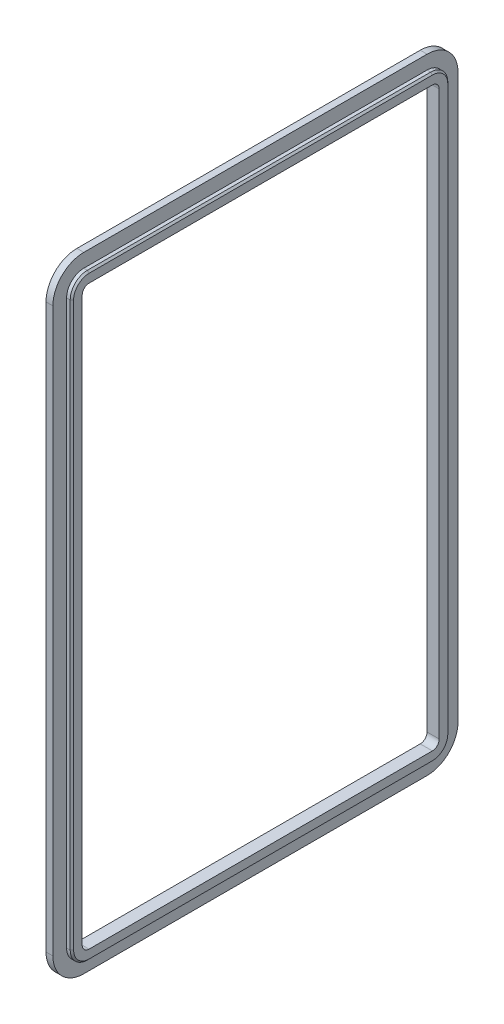
ISO-10303-21;
HEADER;
FILE_DESCRIPTION(('STEP AP214'),'2;1');
FILE_NAME('part.step','',(''),(''),'','','');
FILE_SCHEMA(('AUTOMOTIVE_DESIGN { 1 0 10303 214 1 1 1 1 }'));
ENDSEC;
DATA;
#1=APPLICATION_CONTEXT('core data for automotive mechanical design processes');
#2=APPLICATION_PROTOCOL_DEFINITION('international standard','automotive_design',2000,#1);
#3=PRODUCT_CONTEXT('',#1,'mechanical');
#4=PRODUCT('Part','Part','',(#3));
#5=PRODUCT_RELATED_PRODUCT_CATEGORY('part','',(#4));
#6=PRODUCT_DEFINITION_FORMATION('','',#4);
#7=PRODUCT_DEFINITION_CONTEXT('part definition',#1,'design');
#8=PRODUCT_DEFINITION('design','',#6,#7);
#9=PRODUCT_DEFINITION_SHAPE('','',#8);
#10=(LENGTH_UNIT() NAMED_UNIT(*) SI_UNIT(.MILLI.,.METRE.));
#11=(NAMED_UNIT(*) PLANE_ANGLE_UNIT() SI_UNIT($,.RADIAN.));
#12=(NAMED_UNIT(*) SI_UNIT($,.STERADIAN.) SOLID_ANGLE_UNIT());
#13=UNCERTAINTY_MEASURE_WITH_UNIT(LENGTH_MEASURE(1.E-05),#10,'distance_accuracy_value','');
#14=(GEOMETRIC_REPRESENTATION_CONTEXT(3) GLOBAL_UNCERTAINTY_ASSIGNED_CONTEXT((#13)) GLOBAL_UNIT_ASSIGNED_CONTEXT((#10,
#11,#12)) REPRESENTATION_CONTEXT('',''));
#15=CARTESIAN_POINT('',(0.,0.,0.));
#16=DIRECTION('',(0.,0.,1.));
#17=DIRECTION('',(1.,0.,0.));
#18=AXIS2_PLACEMENT_3D('',#15,#16,#17);
#19=CARTESIAN_POINT('',(104.197158709449,41.,-27.5));
#20=DIRECTION('',(0.,0.,-1.));
#21=DIRECTION('',(0.,1.,0.));
#22=AXIS2_PLACEMENT_3D('',#19,#20,#21);
#23=PLANE('',#22);
#24=DIRECTION('',(-1.,0.,0.));
#25=VECTOR('',#24,1.);
#26=CARTESIAN_POINT('',(104.197158709449,41.,-27.5));
#27=LINE('',#26,#25);
#28=CARTESIAN_POINT('',(0.520000000000007,41.,-27.5));
#29=VERTEX_POINT('',#28);
#30=CARTESIAN_POINT('',(0.,41.,-27.5));
#31=VERTEX_POINT('',#30);
#32=EDGE_CURVE('E438',#29,#31,#27,.T.);
#33=ORIENTED_EDGE('',*,*,#32,.F.);
#34=DIRECTION('',(0.,-1.,0.));
#35=VECTOR('',#34,1.);
#36=CARTESIAN_POINT('',(0.520000000000007,-41.,-27.5));
#37=LINE('',#36,#35);
#38=CARTESIAN_POINT('',(0.520000000000007,-41.,-27.5));
#39=VERTEX_POINT('',#38);
#40=EDGE_CURVE('E477',#29,#39,#37,.T.);
#41=ORIENTED_EDGE('',*,*,#40,.T.);
#42=DIRECTION('',(-1.,0.,0.));
#43=VECTOR('',#42,1.);
#44=CARTESIAN_POINT('',(104.197158709449,-41.,-27.5));
#45=LINE('',#44,#43);
#46=CARTESIAN_POINT('',(0.,-41.,-27.5));
#47=VERTEX_POINT('',#46);
#48=EDGE_CURVE('E437',#39,#47,#45,.T.);
#49=ORIENTED_EDGE('',*,*,#48,.T.);
#50=DIRECTION('',(0.,-1.,0.));
#51=VECTOR('',#50,1.);
#52=CARTESIAN_POINT('',(0.,41.,-27.5));
#53=LINE('',#52,#51);
#54=EDGE_CURVE('E412',#31,#47,#53,.T.);
#55=ORIENTED_EDGE('',*,*,#54,.F.);
#56=EDGE_LOOP('',(#33,#41,#49,#55));
#57=FACE_BOUND('',#56,.T.);
#58=ADVANCED_FACE('F94',(#57),#23,.T.);
#59=CARTESIAN_POINT('',(104.197158709449,41.,-25.));
#60=DIRECTION('',(-1.,0.,0.));
#61=DIRECTION('',(0.,0.,1.));
#62=AXIS2_PLACEMENT_3D('',#59,#60,#61);
#63=CYLINDRICAL_SURFACE('',#62,2.5);
#64=DIRECTION('',(-1.,0.,0.));
#65=VECTOR('',#64,1.);
#66=CARTESIAN_POINT('',(104.197158709449,43.5,-25.));
#67=LINE('',#66,#65);
#68=CARTESIAN_POINT('',(0.520000000000007,43.5,-25.));
#69=VERTEX_POINT('',#68);
#70=CARTESIAN_POINT('',(0.,43.5,-25.));
#71=VERTEX_POINT('',#70);
#72=EDGE_CURVE('E445',#69,#71,#67,.T.);
#73=ORIENTED_EDGE('',*,*,#72,.F.);
#74=CARTESIAN_POINT('',(0.520000000000007,41.,-25.));
#75=DIRECTION('',(-1.,0.,0.));
#76=DIRECTION('',(0.,0.,1.));
#77=AXIS2_PLACEMENT_3D('',#74,#75,#76);
#78=CIRCLE('',#77,2.5);
#79=EDGE_CURVE('E478',#69,#29,#78,.T.);
#80=ORIENTED_EDGE('',*,*,#79,.T.);
#81=ORIENTED_EDGE('',*,*,#32,.T.);
#82=CARTESIAN_POINT('',(0.,41.,-25.));
#83=DIRECTION('',(-1.,0.,0.));
#84=DIRECTION('',(0.,0.,1.));
#85=AXIS2_PLACEMENT_3D('',#82,#83,#84);
#86=CIRCLE('',#85,2.5);
#87=EDGE_CURVE('E434',#71,#31,#86,.T.);
#88=ORIENTED_EDGE('',*,*,#87,.F.);
#89=EDGE_LOOP('',(#73,#80,#81,#88));
#90=FACE_BOUND('',#89,.T.);
#91=ADVANCED_FACE('F551',(#90),#63,.T.);
#92=CARTESIAN_POINT('',(104.197158709449,43.5,25.));
#93=DIRECTION('',(0.,1.,0.));
#94=DIRECTION('',(0.,0.,1.));
#95=AXIS2_PLACEMENT_3D('',#92,#93,#94);
#96=PLANE('',#95);
#97=DIRECTION('',(-1.,0.,0.));
#98=VECTOR('',#97,1.);
#99=CARTESIAN_POINT('',(104.197158709449,43.5,25.));
#100=LINE('',#99,#98);
#101=CARTESIAN_POINT('',(0.520000000000007,43.5,25.));
#102=VERTEX_POINT('',#101);
#103=CARTESIAN_POINT('',(0.,43.5,25.));
#104=VERTEX_POINT('',#103);
#105=EDGE_CURVE('E441',#102,#104,#100,.T.);
#106=ORIENTED_EDGE('',*,*,#105,.F.);
#107=DIRECTION('',(0.,0.,-1.));
#108=VECTOR('',#107,1.);
#109=CARTESIAN_POINT('',(0.520000000000007,43.5,-25.));
#110=LINE('',#109,#108);
#111=EDGE_CURVE('E473',#102,#69,#110,.T.);
#112=ORIENTED_EDGE('',*,*,#111,.T.);
#113=ORIENTED_EDGE('',*,*,#72,.T.);
#114=DIRECTION('',(0.,0.,-1.));
#115=VECTOR('',#114,1.);
#116=CARTESIAN_POINT('',(0.,43.5,25.));
#117=LINE('',#116,#115);
#118=EDGE_CURVE('E435',#104,#71,#117,.T.);
#119=ORIENTED_EDGE('',*,*,#118,.F.);
#120=EDGE_LOOP('',(#106,#112,#113,#119));
#121=FACE_BOUND('',#120,.T.);
#122=ADVANCED_FACE('F563',(#121),#96,.T.);
#123=CARTESIAN_POINT('',(104.197158709449,41.,25.));
#124=DIRECTION('',(-1.,0.,0.));
#125=DIRECTION('',(0.,0.,1.));
#126=AXIS2_PLACEMENT_3D('',#123,#124,#125);
#127=CYLINDRICAL_SURFACE('',#126,2.5);
#128=DIRECTION('',(-1.,0.,0.));
#129=VECTOR('',#128,1.);
#130=CARTESIAN_POINT('',(104.197158709449,41.,27.5));
#131=LINE('',#130,#129);
#132=CARTESIAN_POINT('',(0.520000000000007,41.,27.5));
#133=VERTEX_POINT('',#132);
#134=CARTESIAN_POINT('',(0.,41.,27.5));
#135=VERTEX_POINT('',#134);
#136=EDGE_CURVE('E447',#133,#135,#131,.T.);
#137=ORIENTED_EDGE('',*,*,#136,.F.);
#138=CARTESIAN_POINT('',(0.520000000000007,41.,25.));
#139=DIRECTION('',(-1.,0.,0.));
#140=DIRECTION('',(0.,0.,1.));
#141=AXIS2_PLACEMENT_3D('',#138,#139,#140);
#142=CIRCLE('',#141,2.5);
#143=EDGE_CURVE('E475',#133,#102,#142,.T.);
#144=ORIENTED_EDGE('',*,*,#143,.T.);
#145=ORIENTED_EDGE('',*,*,#105,.T.);
#146=CARTESIAN_POINT('',(0.,41.,25.));
#147=DIRECTION('',(-1.,0.,0.));
#148=DIRECTION('',(0.,0.,1.));
#149=AXIS2_PLACEMENT_3D('',#146,#147,#148);
#150=CIRCLE('',#149,2.5);
#151=EDGE_CURVE('E427',#135,#104,#150,.T.);
#152=ORIENTED_EDGE('',*,*,#151,.F.);
#153=EDGE_LOOP('',(#137,#144,#145,#152));
#154=FACE_BOUND('',#153,.T.);
#155=ADVANCED_FACE('F647',(#154),#127,.T.);
#156=CARTESIAN_POINT('',(104.197158709449,-41.,27.5));
#157=DIRECTION('',(0.,0.,1.));
#158=DIRECTION('',(0.,-1.,0.));
#159=AXIS2_PLACEMENT_3D('',#156,#157,#158);
#160=PLANE('',#159);
#161=DIRECTION('',(-1.,0.,0.));
#162=VECTOR('',#161,1.);
#163=CARTESIAN_POINT('',(104.197158709449,-41.,27.5));
#164=LINE('',#163,#162);
#165=CARTESIAN_POINT('',(0.520000000000007,-41.,27.5));
#166=VERTEX_POINT('',#165);
#167=CARTESIAN_POINT('',(0.,-41.,27.5));
#168=VERTEX_POINT('',#167);
#169=EDGE_CURVE('E450',#166,#168,#164,.T.);
#170=ORIENTED_EDGE('',*,*,#169,.F.);
#171=DIRECTION('',(0.,1.,0.));
#172=VECTOR('',#171,1.);
#173=CARTESIAN_POINT('',(0.520000000000007,41.,27.5));
#174=LINE('',#173,#172);
#175=EDGE_CURVE('E476',#166,#133,#174,.T.);
#176=ORIENTED_EDGE('',*,*,#175,.T.);
#177=ORIENTED_EDGE('',*,*,#136,.T.);
#178=DIRECTION('',(0.,1.,0.));
#179=VECTOR('',#178,1.);
#180=CARTESIAN_POINT('',(0.,-41.,27.5));
#181=LINE('',#180,#179);
#182=EDGE_CURVE('E426',#168,#135,#181,.T.);
#183=ORIENTED_EDGE('',*,*,#182,.F.);
#184=EDGE_LOOP('',(#170,#176,#177,#183));
#185=FACE_BOUND('',#184,.T.);
#186=ADVANCED_FACE('F627',(#185),#160,.T.);
#187=CARTESIAN_POINT('',(104.197158709449,-41.,25.));
#188=DIRECTION('',(-1.,0.,0.));
#189=DIRECTION('',(0.,0.,1.));
#190=AXIS2_PLACEMENT_3D('',#187,#188,#189);
#191=CYLINDRICAL_SURFACE('',#190,2.5);
#192=DIRECTION('',(-1.,0.,0.));
#193=VECTOR('',#192,1.);
#194=CARTESIAN_POINT('',(104.197158709449,-43.5,25.));
#195=LINE('',#194,#193);
#196=CARTESIAN_POINT('',(0.520000000000007,-43.5,25.));
#197=VERTEX_POINT('',#196);
#198=CARTESIAN_POINT('',(0.,-43.5,25.));
#199=VERTEX_POINT('',#198);
#200=EDGE_CURVE('E448',#197,#199,#195,.T.);
#201=ORIENTED_EDGE('',*,*,#200,.F.);
#202=CARTESIAN_POINT('',(0.520000000000007,-41.,25.));
#203=DIRECTION('',(-1.,0.,0.));
#204=DIRECTION('',(0.,0.,1.));
#205=AXIS2_PLACEMENT_3D('',#202,#203,#204);
#206=CIRCLE('',#205,2.5);
#207=EDGE_CURVE('E485',#197,#166,#206,.T.);
#208=ORIENTED_EDGE('',*,*,#207,.T.);
#209=ORIENTED_EDGE('',*,*,#169,.T.);
#210=CARTESIAN_POINT('',(0.,-41.,25.));
#211=DIRECTION('',(-1.,0.,0.));
#212=DIRECTION('',(0.,0.,1.));
#213=AXIS2_PLACEMENT_3D('',#210,#211,#212);
#214=CIRCLE('',#213,2.5);
#215=EDGE_CURVE('E421',#199,#168,#214,.T.);
#216=ORIENTED_EDGE('',*,*,#215,.F.);
#217=EDGE_LOOP('',(#201,#208,#209,#216));
#218=FACE_BOUND('',#217,.T.);
#219=ADVANCED_FACE('F625',(#218),#191,.T.);
#220=CARTESIAN_POINT('',(104.197158709449,-43.5,-25.));
#221=DIRECTION('',(0.,-1.,0.));
#222=DIRECTION('',(0.,0.,-1.));
#223=AXIS2_PLACEMENT_3D('',#220,#221,#222);
#224=PLANE('',#223);
#225=DIRECTION('',(-1.,0.,0.));
#226=VECTOR('',#225,1.);
#227=CARTESIAN_POINT('',(104.197158709449,-43.5,-25.));
#228=LINE('',#227,#226);
#229=CARTESIAN_POINT('',(0.520000000000007,-43.5,-25.));
#230=VERTEX_POINT('',#229);
#231=CARTESIAN_POINT('',(0.,-43.5,-25.));
#232=VERTEX_POINT('',#231);
#233=EDGE_CURVE('E455',#230,#232,#228,.T.);
#234=ORIENTED_EDGE('',*,*,#233,.F.);
#235=DIRECTION('',(0.,0.,1.));
#236=VECTOR('',#235,1.);
#237=CARTESIAN_POINT('',(0.520000000000007,-43.5,25.));
#238=LINE('',#237,#236);
#239=EDGE_CURVE('E13',#230,#197,#238,.T.);
#240=ORIENTED_EDGE('',*,*,#239,.T.);
#241=ORIENTED_EDGE('',*,*,#200,.T.);
#242=DIRECTION('',(0.,0.,1.));
#243=VECTOR('',#242,1.);
#244=CARTESIAN_POINT('',(0.,-43.5,-25.));
#245=LINE('',#244,#243);
#246=EDGE_CURVE('E419',#232,#199,#245,.T.);
#247=ORIENTED_EDGE('',*,*,#246,.F.);
#248=EDGE_LOOP('',(#234,#240,#241,#247));
#249=FACE_BOUND('',#248,.T.);
#250=ADVANCED_FACE('F550',(#249),#224,.T.);
#251=CARTESIAN_POINT('',(104.197158709449,-41.,-25.));
#252=DIRECTION('',(-1.,0.,0.));
#253=DIRECTION('',(0.,0.,1.));
#254=AXIS2_PLACEMENT_3D('',#251,#252,#253);
#255=CYLINDRICAL_SURFACE('',#254,2.5);
#256=ORIENTED_EDGE('',*,*,#48,.F.);
#257=CARTESIAN_POINT('',(0.520000000000007,-41.,-25.));
#258=DIRECTION('',(-1.,0.,0.));
#259=DIRECTION('',(0.,0.,1.));
#260=AXIS2_PLACEMENT_3D('',#257,#258,#259);
#261=CIRCLE('',#260,2.5);
#262=EDGE_CURVE('E102',#39,#230,#261,.T.);
#263=ORIENTED_EDGE('',*,*,#262,.T.);
#264=ORIENTED_EDGE('',*,*,#233,.T.);
#265=CARTESIAN_POINT('',(0.,-41.,-25.));
#266=DIRECTION('',(-1.,0.,0.));
#267=DIRECTION('',(0.,0.,1.));
#268=AXIS2_PLACEMENT_3D('',#265,#266,#267);
#269=CIRCLE('',#268,2.5);
#270=EDGE_CURVE('E417',#47,#232,#269,.T.);
#271=ORIENTED_EDGE('',*,*,#270,.F.);
#272=EDGE_LOOP('',(#256,#263,#264,#271));
#273=FACE_BOUND('',#272,.T.);
#274=ADVANCED_FACE('F532',(#273),#255,.T.);
#275=CARTESIAN_POINT('',(0.770000000000008,0.,-77.775));
#276=DIRECTION('',(-1.,0.,0.));
#277=DIRECTION('',(0.,1.,0.));
#278=AXIS2_PLACEMENT_3D('',#275,#276,#277);
#279=PLANE('',#278);
#280=CARTESIAN_POINT('',(0.770000000000008,41.,-25.));
#281=DIRECTION('',(-1.,0.,0.));
#282=DIRECTION('',(0.,0.,1.));
#283=AXIS2_PLACEMENT_3D('',#280,#281,#282);
#284=CIRCLE('',#283,2.25);
#285=CARTESIAN_POINT('',(0.770000000000008,41.,-27.25));
#286=VERTEX_POINT('',#285);
#287=CARTESIAN_POINT('',(0.770000000000008,43.25,-25.));
#288=VERTEX_POINT('',#287);
#289=EDGE_CURVE('E461',#286,#288,#284,.F.);
#290=ORIENTED_EDGE('',*,*,#289,.T.);
#291=DIRECTION('',(0.,0.,1.));
#292=VECTOR('',#291,1.);
#293=CARTESIAN_POINT('',(0.770000000000008,43.25,25.));
#294=LINE('',#293,#292);
#295=CARTESIAN_POINT('',(0.770000000000008,43.25,25.));
#296=VERTEX_POINT('',#295);
#297=EDGE_CURVE('E466',#288,#296,#294,.T.);
#298=ORIENTED_EDGE('',*,*,#297,.T.);
#299=CARTESIAN_POINT('',(0.770000000000008,41.,25.));
#300=DIRECTION('',(-1.,0.,0.));
#301=DIRECTION('',(0.,0.,1.));
#302=AXIS2_PLACEMENT_3D('',#299,#300,#301);
#303=CIRCLE('',#302,2.25);
#304=CARTESIAN_POINT('',(0.770000000000008,41.,27.25));
#305=VERTEX_POINT('',#304);
#306=EDGE_CURVE('E468',#296,#305,#303,.F.);
#307=ORIENTED_EDGE('',*,*,#306,.T.);
#308=DIRECTION('',(0.,-1.,0.));
#309=VECTOR('',#308,1.);
#310=CARTESIAN_POINT('',(0.770000000000008,-41.,27.25));
#311=LINE('',#310,#309);
#312=CARTESIAN_POINT('',(0.770000000000008,-41.,27.25));
#313=VERTEX_POINT('',#312);
#314=EDGE_CURVE('E464',#305,#313,#311,.T.);
#315=ORIENTED_EDGE('',*,*,#314,.T.);
#316=CARTESIAN_POINT('',(0.770000000000008,-41.,25.));
#317=DIRECTION('',(-1.,0.,0.));
#318=DIRECTION('',(0.,0.,1.));
#319=AXIS2_PLACEMENT_3D('',#316,#317,#318);
#320=CIRCLE('',#319,2.25);
#321=CARTESIAN_POINT('',(0.770000000000008,-43.25,25.));
#322=VERTEX_POINT('',#321);
#323=EDGE_CURVE('E456',#313,#322,#320,.F.);
#324=ORIENTED_EDGE('',*,*,#323,.T.);
#325=DIRECTION('',(0.,0.,-1.));
#326=VECTOR('',#325,1.);
#327=CARTESIAN_POINT('',(0.770000000000008,-43.25,-25.));
#328=LINE('',#327,#326);
#329=CARTESIAN_POINT('',(0.770000000000008,-43.25,-25.));
#330=VERTEX_POINT('',#329);
#331=EDGE_CURVE('E442',#322,#330,#328,.T.);
#332=ORIENTED_EDGE('',*,*,#331,.T.);
#333=CARTESIAN_POINT('',(0.770000000000008,-41.,-25.));
#334=DIRECTION('',(-1.,0.,0.));
#335=DIRECTION('',(0.,0.,1.));
#336=AXIS2_PLACEMENT_3D('',#333,#334,#335);
#337=CIRCLE('',#336,2.25);
#338=CARTESIAN_POINT('',(0.770000000000008,-41.,-27.25));
#339=VERTEX_POINT('',#338);
#340=EDGE_CURVE('E457',#330,#339,#337,.F.);
#341=ORIENTED_EDGE('',*,*,#340,.T.);
#342=DIRECTION('',(0.,1.,0.));
#343=VECTOR('',#342,1.);
#344=CARTESIAN_POINT('',(0.770000000000008,41.,-27.25));
#345=LINE('',#344,#343);
#346=EDGE_CURVE('E458',#339,#286,#345,.T.);
#347=ORIENTED_EDGE('',*,*,#346,.T.);
#348=EDGE_LOOP('',(#290,#298,#307,#315,#324,#332,#341,#347));
#349=FACE_BOUND('',#348,.T.);
#350=CARTESIAN_POINT('',(0.770000000000007,41.,25.));
#351=DIRECTION('',(-1.,0.,0.));
#352=DIRECTION('',(0.,0.,1.));
#353=AXIS2_PLACEMENT_3D('',#350,#351,#352);
#354=CIRCLE('',#353,0.999999952000001);
#355=CARTESIAN_POINT('',(0.770000000000007,41.,25.999999952));
#356=VERTEX_POINT('',#355);
#357=CARTESIAN_POINT('',(0.770000000000007,41.999999952,25.));
#358=VERTEX_POINT('',#357);
#359=EDGE_CURVE('E343',#356,#358,#354,.T.);
#360=ORIENTED_EDGE('',*,*,#359,.T.);
#361=DIRECTION('',(0.,0.,-1.));
#362=VECTOR('',#361,1.);
#363=CARTESIAN_POINT('',(0.770000000000007,41.999999952,0.));
#364=LINE('',#363,#362);
#365=CARTESIAN_POINT('',(0.770000000000007,41.999999952,-25.));
#366=VERTEX_POINT('',#365);
#367=EDGE_CURVE('E323',#358,#366,#364,.T.);
#368=ORIENTED_EDGE('',*,*,#367,.T.);
#369=CARTESIAN_POINT('',(0.770000000000007,41.,-25.));
#370=DIRECTION('',(-1.,0.,0.));
#371=DIRECTION('',(0.,0.,1.));
#372=AXIS2_PLACEMENT_3D('',#369,#370,#371);
#373=CIRCLE('',#372,0.999999952000001);
#374=CARTESIAN_POINT('',(0.770000000000008,41.,-25.999999952));
#375=VERTEX_POINT('',#374);
#376=EDGE_CURVE('E326',#366,#375,#373,.T.);
#377=ORIENTED_EDGE('',*,*,#376,.T.);
#378=DIRECTION('',(0.,-1.,0.));
#379=VECTOR('',#378,1.);
#380=CARTESIAN_POINT('',(0.770000000000007,0.,-25.999999952));
#381=LINE('',#380,#379);
#382=CARTESIAN_POINT('',(0.770000000000007,-41.,-25.999999952));
#383=VERTEX_POINT('',#382);
#384=EDGE_CURVE('E290',#375,#383,#381,.T.);
#385=ORIENTED_EDGE('',*,*,#384,.T.);
#386=CARTESIAN_POINT('',(0.770000000000007,-41.,-25.));
#387=DIRECTION('',(-1.,0.,0.));
#388=DIRECTION('',(0.,0.,1.));
#389=AXIS2_PLACEMENT_3D('',#386,#387,#388);
#390=CIRCLE('',#389,0.999999952000001);
#391=CARTESIAN_POINT('',(0.770000000000007,-41.999999952,-25.));
#392=VERTEX_POINT('',#391);
#393=EDGE_CURVE('E328',#383,#392,#390,.T.);
#394=ORIENTED_EDGE('',*,*,#393,.T.);
#395=DIRECTION('',(0.,0.,1.));
#396=VECTOR('',#395,1.);
#397=CARTESIAN_POINT('',(0.770000000000007,-41.999999952,0.));
#398=LINE('',#397,#396);
#399=CARTESIAN_POINT('',(0.770000000000007,-41.999999952,25.));
#400=VERTEX_POINT('',#399);
#401=EDGE_CURVE('E335',#392,#400,#398,.T.);
#402=ORIENTED_EDGE('',*,*,#401,.T.);
#403=CARTESIAN_POINT('',(0.770000000000007,-41.,25.));
#404=DIRECTION('',(-1.,0.,0.));
#405=DIRECTION('',(0.,0.,1.));
#406=AXIS2_PLACEMENT_3D('',#403,#404,#405);
#407=CIRCLE('',#406,0.999999952000001);
#408=CARTESIAN_POINT('',(0.770000000000007,-41.,25.999999952));
#409=VERTEX_POINT('',#408);
#410=EDGE_CURVE('E333',#400,#409,#407,.T.);
#411=ORIENTED_EDGE('',*,*,#410,.T.);
#412=DIRECTION('',(0.,1.,0.));
#413=VECTOR('',#412,1.);
#414=CARTESIAN_POINT('',(0.770000000000007,0.,25.999999952));
#415=LINE('',#414,#413);
#416=EDGE_CURVE('E340',#409,#356,#415,.T.);
#417=ORIENTED_EDGE('',*,*,#416,.T.);
#418=EDGE_LOOP('',(#360,#368,#377,#385,#394,#402,#411,#417));
#419=FACE_BOUND('',#418,.T.);
#420=ADVANCED_FACE('F535',(#349,#419),#279,.F.);
#421=CARTESIAN_POINT('',(0.,0.,0.));
#422=DIRECTION('',(-1.,0.,0.));
#423=DIRECTION('',(0.,0.,1.));
#424=AXIS2_PLACEMENT_3D('',#421,#422,#423);
#425=PLANE('',#424);
#426=ORIENTED_EDGE('',*,*,#87,.T.);
#427=ORIENTED_EDGE('',*,*,#54,.T.);
#428=ORIENTED_EDGE('',*,*,#270,.T.);
#429=ORIENTED_EDGE('',*,*,#246,.T.);
#430=ORIENTED_EDGE('',*,*,#215,.T.);
#431=ORIENTED_EDGE('',*,*,#182,.T.);
#432=ORIENTED_EDGE('',*,*,#151,.T.);
#433=ORIENTED_EDGE('',*,*,#118,.T.);
#434=EDGE_LOOP('',(#426,#427,#428,#429,#430,#431,#432,#433));
#435=FACE_BOUND('',#434,.T.);
#436=DIRECTION('',(0.,0.,-1.));
#437=VECTOR('',#436,1.);
#438=CARTESIAN_POINT('',(0.,45.5,0.));
#439=LINE('',#438,#437);
#440=CARTESIAN_POINT('',(0.,45.5,25.));
#441=VERTEX_POINT('',#440);
#442=CARTESIAN_POINT('',(0.,45.5,-25.));
#443=VERTEX_POINT('',#442);
#444=EDGE_CURVE('E347',#441,#443,#439,.T.);
#445=ORIENTED_EDGE('',*,*,#444,.F.);
#446=CARTESIAN_POINT('',(0.,41.,25.));
#447=DIRECTION('',(-1.,0.,0.));
#448=DIRECTION('',(0.,0.,1.));
#449=AXIS2_PLACEMENT_3D('',#446,#447,#448);
#450=CIRCLE('',#449,4.5);
#451=CARTESIAN_POINT('',(0.,41.,29.5));
#452=VERTEX_POINT('',#451);
#453=EDGE_CURVE('E363',#452,#441,#450,.T.);
#454=ORIENTED_EDGE('',*,*,#453,.F.);
#455=DIRECTION('',(0.,1.,0.));
#456=VECTOR('',#455,1.);
#457=CARTESIAN_POINT('',(0.,0.,29.5));
#458=LINE('',#457,#456);
#459=CARTESIAN_POINT('',(0.,-41.,29.5));
#460=VERTEX_POINT('',#459);
#461=EDGE_CURVE('E389',#460,#452,#458,.T.);
#462=ORIENTED_EDGE('',*,*,#461,.F.);
#463=CARTESIAN_POINT('',(0.,-41.,25.));
#464=DIRECTION('',(-1.,0.,0.));
#465=DIRECTION('',(0.,0.,1.));
#466=AXIS2_PLACEMENT_3D('',#463,#464,#465);
#467=CIRCLE('',#466,4.5);
#468=CARTESIAN_POINT('',(0.,-45.5,25.));
#469=VERTEX_POINT('',#468);
#470=EDGE_CURVE('E387',#469,#460,#467,.T.);
#471=ORIENTED_EDGE('',*,*,#470,.F.);
#472=DIRECTION('',(0.,0.,1.));
#473=VECTOR('',#472,1.);
#474=CARTESIAN_POINT('',(0.,-45.5,0.));
#475=LINE('',#474,#473);
#476=CARTESIAN_POINT('',(0.,-45.5,-25.));
#477=VERTEX_POINT('',#476);
#478=EDGE_CURVE('E383',#477,#469,#475,.T.);
#479=ORIENTED_EDGE('',*,*,#478,.F.);
#480=CARTESIAN_POINT('',(0.,-41.,-25.));
#481=DIRECTION('',(-1.,0.,0.));
#482=DIRECTION('',(0.,0.,1.));
#483=AXIS2_PLACEMENT_3D('',#480,#481,#482);
#484=CIRCLE('',#483,4.5);
#485=CARTESIAN_POINT('',(0.,-41.,-29.5));
#486=VERTEX_POINT('',#485);
#487=EDGE_CURVE('E385',#486,#477,#484,.T.);
#488=ORIENTED_EDGE('',*,*,#487,.F.);
#489=DIRECTION('',(0.,-1.,0.));
#490=VECTOR('',#489,1.);
#491=CARTESIAN_POINT('',(0.,0.,-29.5));
#492=LINE('',#491,#490);
#493=CARTESIAN_POINT('',(0.,41.,-29.5));
#494=VERTEX_POINT('',#493);
#495=EDGE_CURVE('E379',#494,#486,#492,.T.);
#496=ORIENTED_EDGE('',*,*,#495,.F.);
#497=CARTESIAN_POINT('',(0.,41.,-25.));
#498=DIRECTION('',(-1.,0.,0.));
#499=DIRECTION('',(0.,0.,1.));
#500=AXIS2_PLACEMENT_3D('',#497,#498,#499);
#501=CIRCLE('',#500,4.5);
#502=EDGE_CURVE('E378',#443,#494,#501,.T.);
#503=ORIENTED_EDGE('',*,*,#502,.F.);
#504=EDGE_LOOP('',(#445,#454,#462,#471,#479,#488,#496,#503));
#505=FACE_BOUND('',#504,.T.);
#506=ADVANCED_FACE('F534',(#435,#505),#425,.F.);
#507=CARTESIAN_POINT('',(-1.,45.5,0.));
#508=DIRECTION('',(0.,-1.,0.));
#509=DIRECTION('',(0.,0.,-1.));
#510=AXIS2_PLACEMENT_3D('',#507,#508,#509);
#511=PLANE('',#510);
#512=ORIENTED_EDGE('',*,*,#444,.T.);
#513=DIRECTION('',(1.,0.,0.));
#514=VECTOR('',#513,1.);
#515=CARTESIAN_POINT('',(-1.,45.5,-25.));
#516=LINE('',#515,#514);
#517=CARTESIAN_POINT('',(-1.,45.5,-25.));
#518=VERTEX_POINT('',#517);
#519=EDGE_CURVE('E413',#518,#443,#516,.T.);
#520=ORIENTED_EDGE('',*,*,#519,.F.);
#521=DIRECTION('',(0.,0.,-1.));
#522=VECTOR('',#521,1.);
#523=CARTESIAN_POINT('',(-1.,45.5,0.));
#524=LINE('',#523,#522);
#525=CARTESIAN_POINT('',(-1.,45.5,25.));
#526=VERTEX_POINT('',#525);
#527=EDGE_CURVE('E360',#526,#518,#524,.T.);
#528=ORIENTED_EDGE('',*,*,#527,.F.);
#529=DIRECTION('',(1.,0.,0.));
#530=VECTOR('',#529,1.);
#531=CARTESIAN_POINT('',(-1.,45.5,25.));
#532=LINE('',#531,#530);
#533=EDGE_CURVE('E374',#526,#441,#532,.T.);
#534=ORIENTED_EDGE('',*,*,#533,.T.);
#535=EDGE_LOOP('',(#512,#520,#528,#534));
#536=FACE_BOUND('',#535,.T.);
#537=ADVANCED_FACE('F538',(#536),#511,.F.);
#538=CARTESIAN_POINT('',(-1.,41.,25.));
#539=DIRECTION('',(1.,0.,0.));
#540=DIRECTION('',(0.,0.,-1.));
#541=AXIS2_PLACEMENT_3D('',#538,#539,#540);
#542=CYLINDRICAL_SURFACE('',#541,4.5);
#543=ORIENTED_EDGE('',*,*,#453,.T.);
#544=ORIENTED_EDGE('',*,*,#533,.F.);
#545=CARTESIAN_POINT('',(-1.,41.,25.));
#546=DIRECTION('',(-1.,0.,0.));
#547=DIRECTION('',(0.,0.,1.));
#548=AXIS2_PLACEMENT_3D('',#545,#546,#547);
#549=CIRCLE('',#548,4.5);
#550=CARTESIAN_POINT('',(-1.,41.,29.5));
#551=VERTEX_POINT('',#550);
#552=EDGE_CURVE('E373',#551,#526,#549,.T.);
#553=ORIENTED_EDGE('',*,*,#552,.F.);
#554=DIRECTION('',(1.,0.,0.));
#555=VECTOR('',#554,1.);
#556=CARTESIAN_POINT('',(-1.,41.,29.5));
#557=LINE('',#556,#555);
#558=EDGE_CURVE('E395',#551,#452,#557,.T.);
#559=ORIENTED_EDGE('',*,*,#558,.T.);
#560=EDGE_LOOP('',(#543,#544,#553,#559));
#561=FACE_BOUND('',#560,.T.);
#562=ADVANCED_FACE('F546',(#561),#542,.T.);
#563=CARTESIAN_POINT('',(-1.,0.,29.5));
#564=DIRECTION('',(0.,0.,-1.));
#565=DIRECTION('',(0.,1.,0.));
#566=AXIS2_PLACEMENT_3D('',#563,#564,#565);
#567=PLANE('',#566);
#568=ORIENTED_EDGE('',*,*,#461,.T.);
#569=ORIENTED_EDGE('',*,*,#558,.F.);
#570=DIRECTION('',(0.,1.,0.));
#571=VECTOR('',#570,1.);
#572=CARTESIAN_POINT('',(-1.,0.,29.5));
#573=LINE('',#572,#571);
#574=CARTESIAN_POINT('',(-1.,-41.,29.5));
#575=VERTEX_POINT('',#574);
#576=EDGE_CURVE('E371',#575,#551,#573,.T.);
#577=ORIENTED_EDGE('',*,*,#576,.F.);
#578=DIRECTION('',(1.,0.,0.));
#579=VECTOR('',#578,1.);
#580=CARTESIAN_POINT('',(-1.,-41.,29.5));
#581=LINE('',#580,#579);
#582=EDGE_CURVE('E398',#575,#460,#581,.T.);
#583=ORIENTED_EDGE('',*,*,#582,.T.);
#584=EDGE_LOOP('',(#568,#569,#577,#583));
#585=FACE_BOUND('',#584,.T.);
#586=ADVANCED_FACE('F707',(#585),#567,.F.);
#587=CARTESIAN_POINT('',(-1.,-41.,25.));
#588=DIRECTION('',(1.,0.,0.));
#589=DIRECTION('',(0.,0.,-1.));
#590=AXIS2_PLACEMENT_3D('',#587,#588,#589);
#591=CYLINDRICAL_SURFACE('',#590,4.5);
#592=ORIENTED_EDGE('',*,*,#470,.T.);
#593=ORIENTED_EDGE('',*,*,#582,.F.);
#594=CARTESIAN_POINT('',(-1.,-41.,25.));
#595=DIRECTION('',(-1.,0.,0.));
#596=DIRECTION('',(0.,0.,1.));
#597=AXIS2_PLACEMENT_3D('',#594,#595,#596);
#598=CIRCLE('',#597,4.5);
#599=CARTESIAN_POINT('',(-1.,-45.5,25.));
#600=VERTEX_POINT('',#599);
#601=EDGE_CURVE('E369',#600,#575,#598,.T.);
#602=ORIENTED_EDGE('',*,*,#601,.F.);
#603=DIRECTION('',(1.,0.,0.));
#604=VECTOR('',#603,1.);
#605=CARTESIAN_POINT('',(-1.,-45.5,25.));
#606=LINE('',#605,#604);
#607=EDGE_CURVE('E397',#600,#469,#606,.T.);
#608=ORIENTED_EDGE('',*,*,#607,.T.);
#609=EDGE_LOOP('',(#592,#593,#602,#608));
#610=FACE_BOUND('',#609,.T.);
#611=ADVANCED_FACE('F724',(#610),#591,.T.);
#612=CARTESIAN_POINT('',(-1.,-45.5,0.));
#613=DIRECTION('',(0.,1.,0.));
#614=DIRECTION('',(0.,0.,1.));
#615=AXIS2_PLACEMENT_3D('',#612,#613,#614);
#616=PLANE('',#615);
#617=ORIENTED_EDGE('',*,*,#478,.T.);
#618=ORIENTED_EDGE('',*,*,#607,.F.);
#619=DIRECTION('',(0.,0.,1.));
#620=VECTOR('',#619,1.);
#621=CARTESIAN_POINT('',(-1.,-45.5,0.));
#622=LINE('',#621,#620);
#623=CARTESIAN_POINT('',(-1.,-45.5,-25.));
#624=VERTEX_POINT('',#623);
#625=EDGE_CURVE('E370',#624,#600,#622,.T.);
#626=ORIENTED_EDGE('',*,*,#625,.F.);
#627=DIRECTION('',(1.,0.,0.));
#628=VECTOR('',#627,1.);
#629=CARTESIAN_POINT('',(-1.,-45.5,-25.));
#630=LINE('',#629,#628);
#631=EDGE_CURVE('E405',#624,#477,#630,.T.);
#632=ORIENTED_EDGE('',*,*,#631,.T.);
#633=EDGE_LOOP('',(#617,#618,#626,#632));
#634=FACE_BOUND('',#633,.T.);
#635=ADVANCED_FACE('F733',(#634),#616,.F.);
#636=CARTESIAN_POINT('',(-1.,-41.,-25.));
#637=DIRECTION('',(1.,0.,0.));
#638=DIRECTION('',(0.,0.,-1.));
#639=AXIS2_PLACEMENT_3D('',#636,#637,#638);
#640=CYLINDRICAL_SURFACE('',#639,4.5);
#641=ORIENTED_EDGE('',*,*,#487,.T.);
#642=ORIENTED_EDGE('',*,*,#631,.F.);
#643=CARTESIAN_POINT('',(-1.,-41.,-25.));
#644=DIRECTION('',(-1.,0.,0.));
#645=DIRECTION('',(0.,0.,1.));
#646=AXIS2_PLACEMENT_3D('',#643,#644,#645);
#647=CIRCLE('',#646,4.5);
#648=CARTESIAN_POINT('',(-1.,-41.,-29.5));
#649=VERTEX_POINT('',#648);
#650=EDGE_CURVE('E364',#649,#624,#647,.T.);
#651=ORIENTED_EDGE('',*,*,#650,.F.);
#652=DIRECTION('',(1.,0.,0.));
#653=VECTOR('',#652,1.);
#654=CARTESIAN_POINT('',(-1.,-41.,-29.5));
#655=LINE('',#654,#653);
#656=EDGE_CURVE('E403',#649,#486,#655,.T.);
#657=ORIENTED_EDGE('',*,*,#656,.T.);
#658=EDGE_LOOP('',(#641,#642,#651,#657));
#659=FACE_BOUND('',#658,.T.);
#660=ADVANCED_FACE('F746',(#659),#640,.T.);
#661=CARTESIAN_POINT('',(-1.,0.,-29.5));
#662=DIRECTION('',(0.,0.,1.));
#663=DIRECTION('',(0.,-1.,0.));
#664=AXIS2_PLACEMENT_3D('',#661,#662,#663);
#665=PLANE('',#664);
#666=ORIENTED_EDGE('',*,*,#495,.T.);
#667=ORIENTED_EDGE('',*,*,#656,.F.);
#668=DIRECTION('',(0.,-1.,0.));
#669=VECTOR('',#668,1.);
#670=CARTESIAN_POINT('',(-1.,0.,-29.5));
#671=LINE('',#670,#669);
#672=CARTESIAN_POINT('',(-1.,41.,-29.5));
#673=VERTEX_POINT('',#672);
#674=EDGE_CURVE('E361',#673,#649,#671,.T.);
#675=ORIENTED_EDGE('',*,*,#674,.F.);
#676=DIRECTION('',(1.,0.,0.));
#677=VECTOR('',#676,1.);
#678=CARTESIAN_POINT('',(-1.,41.,-29.5));
#679=LINE('',#678,#677);
#680=EDGE_CURVE('E410',#673,#494,#679,.T.);
#681=ORIENTED_EDGE('',*,*,#680,.T.);
#682=EDGE_LOOP('',(#666,#667,#675,#681));
#683=FACE_BOUND('',#682,.T.);
#684=ADVANCED_FACE('F761',(#683),#665,.F.);
#685=CARTESIAN_POINT('',(-1.,41.,-25.));
#686=DIRECTION('',(1.,0.,0.));
#687=DIRECTION('',(0.,0.,-1.));
#688=AXIS2_PLACEMENT_3D('',#685,#686,#687);
#689=CYLINDRICAL_SURFACE('',#688,4.5);
#690=ORIENTED_EDGE('',*,*,#502,.T.);
#691=ORIENTED_EDGE('',*,*,#680,.F.);
#692=CARTESIAN_POINT('',(-1.,41.,-25.));
#693=DIRECTION('',(-1.,0.,0.));
#694=DIRECTION('',(0.,0.,1.));
#695=AXIS2_PLACEMENT_3D('',#692,#693,#694);
#696=CIRCLE('',#695,4.5);
#697=EDGE_CURVE('E359',#518,#673,#696,.T.);
#698=ORIENTED_EDGE('',*,*,#697,.F.);
#699=ORIENTED_EDGE('',*,*,#519,.T.);
#700=EDGE_LOOP('',(#690,#691,#698,#699));
#701=FACE_BOUND('',#700,.T.);
#702=ADVANCED_FACE('F771',(#701),#689,.T.);
#703=CARTESIAN_POINT('',(-1.,0.,0.));
#704=DIRECTION('',(-1.,0.,0.));
#705=DIRECTION('',(0.,0.,1.));
#706=AXIS2_PLACEMENT_3D('',#703,#704,#705);
#707=PLANE('',#706);
#708=DIRECTION('',(0.,0.,-1.));
#709=VECTOR('',#708,1.);
#710=CARTESIAN_POINT('',(-1.,41.999999952,0.));
#711=LINE('',#710,#709);
#712=CARTESIAN_POINT('',(-1.,41.999999952,25.));
#713=VERTEX_POINT('',#712);
#714=CARTESIAN_POINT('',(-1.,41.999999952,-25.));
#715=VERTEX_POINT('',#714);
#716=EDGE_CURVE('E298',#713,#715,#711,.T.);
#717=ORIENTED_EDGE('',*,*,#716,.F.);
#718=CARTESIAN_POINT('',(-1.,41.,25.));
#719=DIRECTION('',(-1.,0.,0.));
#720=DIRECTION('',(0.,0.,1.));
#721=AXIS2_PLACEMENT_3D('',#718,#719,#720);
#722=CIRCLE('',#721,0.999999952000001);
#723=CARTESIAN_POINT('',(-1.,41.,25.999999952));
#724=VERTEX_POINT('',#723);
#725=EDGE_CURVE('E319',#724,#713,#722,.T.);
#726=ORIENTED_EDGE('',*,*,#725,.F.);
#727=DIRECTION('',(0.,1.,0.));
#728=VECTOR('',#727,1.);
#729=CARTESIAN_POINT('',(-1.,0.,25.999999952));
#730=LINE('',#729,#728);
#731=CARTESIAN_POINT('',(-1.,-41.,25.999999952));
#732=VERTEX_POINT('',#731);
#733=EDGE_CURVE('E320',#732,#724,#730,.T.);
#734=ORIENTED_EDGE('',*,*,#733,.F.);
#735=CARTESIAN_POINT('',(-1.,-41.,25.));
#736=DIRECTION('',(-1.,0.,0.));
#737=DIRECTION('',(0.,0.,1.));
#738=AXIS2_PLACEMENT_3D('',#735,#736,#737);
#739=CIRCLE('',#738,0.999999952000001);
#740=CARTESIAN_POINT('',(-1.,-41.999999952,25.));
#741=VERTEX_POINT('',#740);
#742=EDGE_CURVE('E314',#741,#732,#739,.T.);
#743=ORIENTED_EDGE('',*,*,#742,.F.);
#744=DIRECTION('',(0.,0.,1.));
#745=VECTOR('',#744,1.);
#746=CARTESIAN_POINT('',(-1.,-41.999999952,0.));
#747=LINE('',#746,#745);
#748=CARTESIAN_POINT('',(-1.,-41.999999952,-25.));
#749=VERTEX_POINT('',#748);
#750=EDGE_CURVE('E306',#749,#741,#747,.T.);
#751=ORIENTED_EDGE('',*,*,#750,.F.);
#752=CARTESIAN_POINT('',(-1.,-41.,-25.));
#753=DIRECTION('',(-1.,0.,0.));
#754=DIRECTION('',(0.,0.,1.));
#755=AXIS2_PLACEMENT_3D('',#752,#753,#754);
#756=CIRCLE('',#755,0.999999952000001);
#757=CARTESIAN_POINT('',(-1.,-41.,-25.999999952));
#758=VERTEX_POINT('',#757);
#759=EDGE_CURVE('E308',#758,#749,#756,.T.);
#760=ORIENTED_EDGE('',*,*,#759,.F.);
#761=DIRECTION('',(0.,-1.,0.));
#762=VECTOR('',#761,1.);
#763=CARTESIAN_POINT('',(-1.,0.,-25.999999952));
#764=LINE('',#763,#762);
#765=CARTESIAN_POINT('',(-1.,41.,-25.999999952));
#766=VERTEX_POINT('',#765);
#767=EDGE_CURVE('E281',#766,#758,#764,.T.);
#768=ORIENTED_EDGE('',*,*,#767,.F.);
#769=CARTESIAN_POINT('',(-1.,41.,-25.));
#770=DIRECTION('',(-1.,0.,0.));
#771=DIRECTION('',(0.,0.,1.));
#772=AXIS2_PLACEMENT_3D('',#769,#770,#771);
#773=CIRCLE('',#772,0.999999952000001);
#774=EDGE_CURVE('E297',#715,#766,#773,.T.);
#775=ORIENTED_EDGE('',*,*,#774,.F.);
#776=EDGE_LOOP('',(#717,#726,#734,#743,#751,#760,#768,#775));
#777=FACE_BOUND('',#776,.T.);
#778=ORIENTED_EDGE('',*,*,#527,.T.);
#779=ORIENTED_EDGE('',*,*,#697,.T.);
#780=ORIENTED_EDGE('',*,*,#674,.T.);
#781=ORIENTED_EDGE('',*,*,#650,.T.);
#782=ORIENTED_EDGE('',*,*,#625,.T.);
#783=ORIENTED_EDGE('',*,*,#601,.T.);
#784=ORIENTED_EDGE('',*,*,#576,.T.);
#785=ORIENTED_EDGE('',*,*,#552,.T.);
#786=EDGE_LOOP('',(#778,#779,#780,#781,#782,#783,#784,#785));
#787=FACE_BOUND('',#786,.T.);
#788=ADVANCED_FACE('F305',(#777,#787),#707,.T.);
#789=CARTESIAN_POINT('',(0.770000000000007,41.999999952,0.));
#790=DIRECTION('',(0.,1.,0.));
#791=DIRECTION('',(0.,0.,1.));
#792=AXIS2_PLACEMENT_3D('',#789,#790,#791);
#793=PLANE('',#792);
#794=DIRECTION('',(-1.,0.,0.));
#795=VECTOR('',#794,1.);
#796=CARTESIAN_POINT('',(0.770000000000007,41.999999952,-25.));
#797=LINE('',#796,#795);
#798=EDGE_CURVE('E295',#366,#715,#797,.T.);
#799=ORIENTED_EDGE('',*,*,#798,.F.);
#800=ORIENTED_EDGE('',*,*,#367,.F.);
#801=DIRECTION('',(-1.,0.,0.));
#802=VECTOR('',#801,1.);
#803=CARTESIAN_POINT('',(0.770000000000007,41.999999952,25.));
#804=LINE('',#803,#802);
#805=EDGE_CURVE('E342',#358,#713,#804,.T.);
#806=ORIENTED_EDGE('',*,*,#805,.T.);
#807=ORIENTED_EDGE('',*,*,#716,.T.);
#808=EDGE_LOOP('',(#799,#800,#806,#807));
#809=FACE_BOUND('',#808,.T.);
#810=ADVANCED_FACE('F512',(#809),#793,.F.);
#811=CARTESIAN_POINT('',(0.770000000000007,41.,25.));
#812=DIRECTION('',(-1.,0.,0.));
#813=DIRECTION('',(0.,0.,1.));
#814=AXIS2_PLACEMENT_3D('',#811,#812,#813);
#815=CYLINDRICAL_SURFACE('',#814,0.999999952000001);
#816=ORIENTED_EDGE('',*,*,#805,.F.);
#817=ORIENTED_EDGE('',*,*,#359,.F.);
#818=DIRECTION('',(-1.,0.,0.));
#819=VECTOR('',#818,1.);
#820=CARTESIAN_POINT('',(0.770000000000007,41.,25.999999952));
#821=LINE('',#820,#819);
#822=EDGE_CURVE('E350',#356,#724,#821,.T.);
#823=ORIENTED_EDGE('',*,*,#822,.T.);
#824=ORIENTED_EDGE('',*,*,#725,.T.);
#825=EDGE_LOOP('',(#816,#817,#823,#824));
#826=FACE_BOUND('',#825,.T.);
#827=ADVANCED_FACE('F519',(#826),#815,.F.);
#828=CARTESIAN_POINT('',(0.770000000000007,0.,25.999999952));
#829=DIRECTION('',(0.,0.,1.));
#830=DIRECTION('',(0.,-1.,0.));
#831=AXIS2_PLACEMENT_3D('',#828,#829,#830);
#832=PLANE('',#831);
#833=ORIENTED_EDGE('',*,*,#822,.F.);
#834=ORIENTED_EDGE('',*,*,#416,.F.);
#835=DIRECTION('',(-1.,0.,0.));
#836=VECTOR('',#835,1.);
#837=CARTESIAN_POINT('',(0.770000000000007,-41.,25.999999952));
#838=LINE('',#837,#836);
#839=EDGE_CURVE('E349',#409,#732,#838,.T.);
#840=ORIENTED_EDGE('',*,*,#839,.T.);
#841=ORIENTED_EDGE('',*,*,#733,.T.);
#842=EDGE_LOOP('',(#833,#834,#840,#841));
#843=FACE_BOUND('',#842,.T.);
#844=ADVANCED_FACE('F523',(#843),#832,.F.);
#845=CARTESIAN_POINT('',(0.770000000000007,-41.,25.));
#846=DIRECTION('',(-1.,0.,0.));
#847=DIRECTION('',(0.,0.,1.));
#848=AXIS2_PLACEMENT_3D('',#845,#846,#847);
#849=CYLINDRICAL_SURFACE('',#848,0.999999952000001);
#850=ORIENTED_EDGE('',*,*,#839,.F.);
#851=ORIENTED_EDGE('',*,*,#410,.F.);
#852=DIRECTION('',(-1.,0.,0.));
#853=VECTOR('',#852,1.);
#854=CARTESIAN_POINT('',(0.770000000000007,-41.999999952,25.));
#855=LINE('',#854,#853);
#856=EDGE_CURVE('E352',#400,#741,#855,.T.);
#857=ORIENTED_EDGE('',*,*,#856,.T.);
#858=ORIENTED_EDGE('',*,*,#742,.T.);
#859=EDGE_LOOP('',(#850,#851,#857,#858));
#860=FACE_BOUND('',#859,.T.);
#861=ADVANCED_FACE('F522',(#860),#849,.F.);
#862=CARTESIAN_POINT('',(0.770000000000007,-41.999999952,0.));
#863=DIRECTION('',(0.,-1.,0.));
#864=DIRECTION('',(0.,0.,-1.));
#865=AXIS2_PLACEMENT_3D('',#862,#863,#864);
#866=PLANE('',#865);
#867=ORIENTED_EDGE('',*,*,#856,.F.);
#868=ORIENTED_EDGE('',*,*,#401,.F.);
#869=DIRECTION('',(-1.,0.,0.));
#870=VECTOR('',#869,1.);
#871=CARTESIAN_POINT('',(0.770000000000007,-41.999999952,-25.));
#872=LINE('',#871,#870);
#873=EDGE_CURVE('E355',#392,#749,#872,.T.);
#874=ORIENTED_EDGE('',*,*,#873,.T.);
#875=ORIENTED_EDGE('',*,*,#750,.T.);
#876=EDGE_LOOP('',(#867,#868,#874,#875));
#877=FACE_BOUND('',#876,.T.);
#878=ADVANCED_FACE('F528',(#877),#866,.F.);
#879=CARTESIAN_POINT('',(0.770000000000007,-41.,-25.));
#880=DIRECTION('',(-1.,0.,0.));
#881=DIRECTION('',(0.,0.,1.));
#882=AXIS2_PLACEMENT_3D('',#879,#880,#881);
#883=CYLINDRICAL_SURFACE('',#882,0.999999952000001);
#884=ORIENTED_EDGE('',*,*,#873,.F.);
#885=ORIENTED_EDGE('',*,*,#393,.F.);
#886=DIRECTION('',(-1.,0.,0.));
#887=VECTOR('',#886,1.);
#888=CARTESIAN_POINT('',(0.770000000000007,-41.,-25.999999952));
#889=LINE('',#888,#887);
#890=EDGE_CURVE('E292',#383,#758,#889,.T.);
#891=ORIENTED_EDGE('',*,*,#890,.T.);
#892=ORIENTED_EDGE('',*,*,#759,.T.);
#893=EDGE_LOOP('',(#884,#885,#891,#892));
#894=FACE_BOUND('',#893,.T.);
#895=ADVANCED_FACE('F529',(#894),#883,.F.);
#896=CARTESIAN_POINT('',(0.770000000000007,0.,-25.999999952));
#897=DIRECTION('',(0.,0.,-1.));
#898=DIRECTION('',(0.,1.,0.));
#899=AXIS2_PLACEMENT_3D('',#896,#897,#898);
#900=PLANE('',#899);
#901=ORIENTED_EDGE('',*,*,#890,.F.);
#902=ORIENTED_EDGE('',*,*,#384,.F.);
#903=DIRECTION('',(-1.,0.,0.));
#904=VECTOR('',#903,1.);
#905=CARTESIAN_POINT('',(0.770000000000007,41.,-25.999999952));
#906=LINE('',#905,#904);
#907=EDGE_CURVE('E278',#375,#766,#906,.T.);
#908=ORIENTED_EDGE('',*,*,#907,.T.);
#909=ORIENTED_EDGE('',*,*,#767,.T.);
#910=EDGE_LOOP('',(#901,#902,#908,#909));
#911=FACE_BOUND('',#910,.T.);
#912=ADVANCED_FACE('F284',(#911),#900,.F.);
#913=CARTESIAN_POINT('',(0.770000000000007,41.,-25.));
#914=DIRECTION('',(-1.,0.,0.));
#915=DIRECTION('',(0.,0.,1.));
#916=AXIS2_PLACEMENT_3D('',#913,#914,#915);
#917=CYLINDRICAL_SURFACE('',#916,0.999999952000001);
#918=ORIENTED_EDGE('',*,*,#907,.F.);
#919=ORIENTED_EDGE('',*,*,#376,.F.);
#920=ORIENTED_EDGE('',*,*,#798,.T.);
#921=ORIENTED_EDGE('',*,*,#774,.T.);
#922=EDGE_LOOP('',(#918,#919,#920,#921));
#923=FACE_BOUND('',#922,.T.);
#924=ADVANCED_FACE('F299',(#923),#917,.F.);
#925=CARTESIAN_POINT('',(0.770000000000008,-43.25,-77.775));
#926=DIRECTION('',(0.707106781186545,-0.70710678118655,0.));
#927=DIRECTION('',(0.,0.,1.));
#928=AXIS2_PLACEMENT_3D('',#925,#926,#927);
#929=PLANE('',#928);
#930=DIRECTION('',(0.707106781186549,0.707106781186546,0.));
#931=VECTOR('',#930,1.);
#932=CARTESIAN_POINT('',(0.520000000000007,-43.5,25.));
#933=LINE('',#932,#931);
#934=EDGE_CURVE('E498',#197,#322,#933,.T.);
#935=ORIENTED_EDGE('',*,*,#934,.F.);
#936=ORIENTED_EDGE('',*,*,#239,.F.);
#937=DIRECTION('',(-0.707106781186549,-0.707106781186546,0.));
#938=VECTOR('',#937,1.);
#939=CARTESIAN_POINT('',(0.770000000000008,-43.25,-25.));
#940=LINE('',#939,#938);
#941=EDGE_CURVE('E97',#330,#230,#940,.T.);
#942=ORIENTED_EDGE('',*,*,#941,.F.);
#943=ORIENTED_EDGE('',*,*,#331,.F.);
#944=EDGE_LOOP('',(#935,#936,#942,#943));
#945=FACE_BOUND('',#944,.T.);
#946=ADVANCED_FACE('F100',(#945),#929,.T.);
#947=CARTESIAN_POINT('',(0.770000000000007,-41.,-25.));
#948=DIRECTION('',(-1.,0.,0.));
#949=DIRECTION('',(0.,0.,1.));
#950=AXIS2_PLACEMENT_3D('',#947,#948,#949);
#951=CONICAL_SURFACE('',#950,2.25,0.785398163397448);
#952=ORIENTED_EDGE('',*,*,#941,.T.);
#953=ORIENTED_EDGE('',*,*,#262,.F.);
#954=DIRECTION('',(-0.707106781186549,0.,-0.707106781186546));
#955=VECTOR('',#954,1.);
#956=CARTESIAN_POINT('',(0.770000000000008,-41.,-27.25));
#957=LINE('',#956,#955);
#958=EDGE_CURVE('E499',#339,#39,#957,.T.);
#959=ORIENTED_EDGE('',*,*,#958,.F.);
#960=ORIENTED_EDGE('',*,*,#340,.F.);
#961=EDGE_LOOP('',(#952,#953,#959,#960));
#962=FACE_BOUND('',#961,.T.);
#963=ADVANCED_FACE('F610',(#962),#951,.T.);
#964=CARTESIAN_POINT('',(0.770000000000007,-41.,25.));
#965=DIRECTION('',(-1.,0.,0.));
#966=DIRECTION('',(0.,0.,1.));
#967=AXIS2_PLACEMENT_3D('',#964,#965,#966);
#968=CONICAL_SURFACE('',#967,2.25,0.785398163397448);
#969=ORIENTED_EDGE('',*,*,#934,.T.);
#970=ORIENTED_EDGE('',*,*,#323,.F.);
#971=DIRECTION('',(0.707106781186549,0.,-0.707106781186546));
#972=VECTOR('',#971,1.);
#973=CARTESIAN_POINT('',(0.520000000000007,-41.,27.5));
#974=LINE('',#973,#972);
#975=EDGE_CURVE('E494',#166,#313,#974,.T.);
#976=ORIENTED_EDGE('',*,*,#975,.F.);
#977=ORIENTED_EDGE('',*,*,#207,.F.);
#978=EDGE_LOOP('',(#969,#970,#976,#977));
#979=FACE_BOUND('',#978,.T.);
#980=ADVANCED_FACE('F601',(#979),#968,.T.);
#981=CARTESIAN_POINT('',(0.770000000000008,0.,-27.25));
#982=DIRECTION('',(0.707106781186541,0.,-0.707106781186554));
#983=DIRECTION('',(0.,-1.,0.));
#984=AXIS2_PLACEMENT_3D('',#981,#982,#983);
#985=PLANE('',#984);
#986=ORIENTED_EDGE('',*,*,#958,.T.);
#987=ORIENTED_EDGE('',*,*,#40,.F.);
#988=DIRECTION('',(-0.707106781186554,0.,-0.707106781186541));
#989=VECTOR('',#988,1.);
#990=CARTESIAN_POINT('',(0.770000000000008,41.,-27.25));
#991=LINE('',#990,#989);
#992=EDGE_CURVE('E495',#286,#29,#991,.T.);
#993=ORIENTED_EDGE('',*,*,#992,.F.);
#994=ORIENTED_EDGE('',*,*,#346,.F.);
#995=EDGE_LOOP('',(#986,#987,#993,#994));
#996=FACE_BOUND('',#995,.T.);
#997=ADVANCED_FACE('F592',(#996),#985,.T.);
#998=CARTESIAN_POINT('',(0.770000000000008,0.,27.25));
#999=DIRECTION('',(0.707106781186546,0.,0.707106781186549));
#1000=DIRECTION('',(0.,1.,0.));
#1001=AXIS2_PLACEMENT_3D('',#998,#999,#1000);
#1002=PLANE('',#1001);
#1003=ORIENTED_EDGE('',*,*,#975,.T.);
#1004=ORIENTED_EDGE('',*,*,#314,.F.);
#1005=DIRECTION('',(0.707106781186549,0.,-0.707106781186546));
#1006=VECTOR('',#1005,1.);
#1007=CARTESIAN_POINT('',(0.520000000000007,41.,27.5));
#1008=LINE('',#1007,#1006);
#1009=EDGE_CURVE('E487',#133,#305,#1008,.T.);
#1010=ORIENTED_EDGE('',*,*,#1009,.F.);
#1011=ORIENTED_EDGE('',*,*,#175,.F.);
#1012=EDGE_LOOP('',(#1003,#1004,#1010,#1011));
#1013=FACE_BOUND('',#1012,.T.);
#1014=ADVANCED_FACE('F590',(#1013),#1002,.T.);
#1015=CARTESIAN_POINT('',(0.770000000000007,41.,-25.));
#1016=DIRECTION('',(-1.,0.,0.));
#1017=DIRECTION('',(0.,0.,1.));
#1018=AXIS2_PLACEMENT_3D('',#1015,#1016,#1017);
#1019=CONICAL_SURFACE('',#1018,2.25,0.785398163397448);
#1020=ORIENTED_EDGE('',*,*,#992,.T.);
#1021=ORIENTED_EDGE('',*,*,#79,.F.);
#1022=DIRECTION('',(-0.707106781186549,0.707106781186546,0.));
#1023=VECTOR('',#1022,1.);
#1024=CARTESIAN_POINT('',(0.770000000000008,43.25,-25.));
#1025=LINE('',#1024,#1023);
#1026=EDGE_CURVE('E490',#288,#69,#1025,.T.);
#1027=ORIENTED_EDGE('',*,*,#1026,.F.);
#1028=ORIENTED_EDGE('',*,*,#289,.F.);
#1029=EDGE_LOOP('',(#1020,#1021,#1027,#1028));
#1030=FACE_BOUND('',#1029,.T.);
#1031=ADVANCED_FACE('F579',(#1030),#1019,.T.);
#1032=CARTESIAN_POINT('',(0.770000000000007,41.,25.));
#1033=DIRECTION('',(-1.,0.,0.));
#1034=DIRECTION('',(0.,0.,1.));
#1035=AXIS2_PLACEMENT_3D('',#1032,#1033,#1034);
#1036=CONICAL_SURFACE('',#1035,2.25,0.785398163397448);
#1037=ORIENTED_EDGE('',*,*,#1009,.T.);
#1038=ORIENTED_EDGE('',*,*,#306,.F.);
#1039=DIRECTION('',(0.707106781186549,-0.707106781186546,0.));
#1040=VECTOR('',#1039,1.);
#1041=CARTESIAN_POINT('',(0.520000000000007,43.5,25.));
#1042=LINE('',#1041,#1040);
#1043=EDGE_CURVE('E484',#102,#296,#1042,.T.);
#1044=ORIENTED_EDGE('',*,*,#1043,.F.);
#1045=ORIENTED_EDGE('',*,*,#143,.F.);
#1046=EDGE_LOOP('',(#1037,#1038,#1044,#1045));
#1047=FACE_BOUND('',#1046,.T.);
#1048=ADVANCED_FACE('F575',(#1047),#1036,.T.);
#1049=CARTESIAN_POINT('',(0.770000000000008,43.25,-77.775));
#1050=DIRECTION('',(0.707106781186543,0.707106781186552,0.));
#1051=DIRECTION('',(0.,0.,-1.));
#1052=AXIS2_PLACEMENT_3D('',#1049,#1050,#1051);
#1053=PLANE('',#1052);
#1054=ORIENTED_EDGE('',*,*,#1026,.T.);
#1055=ORIENTED_EDGE('',*,*,#111,.F.);
#1056=ORIENTED_EDGE('',*,*,#1043,.T.);
#1057=ORIENTED_EDGE('',*,*,#297,.F.);
#1058=EDGE_LOOP('',(#1054,#1055,#1056,#1057));
#1059=FACE_BOUND('',#1058,.T.);
#1060=ADVANCED_FACE('F570',(#1059),#1053,.T.);
#1061=CLOSED_SHELL('',(#58,#91,#122,#155,#186,#219,#250,#274,#420,#506,#537,#562,#586,#611,#635,
#660,#684,#702,#788,#810,#827,#844,#861,#878,#895,#912,#924,#946,#963,#980,#997,#1014,#1031,
#1048,#1060));
#1062=MANIFOLD_SOLID_BREP('B2',#1061);
#1063=ADVANCED_BREP_SHAPE_REPRESENTATION('',(#18,#1062),#14);
#1064=SHAPE_DEFINITION_REPRESENTATION(#9,#1063);
ENDSEC;
END-ISO-10303-21;
